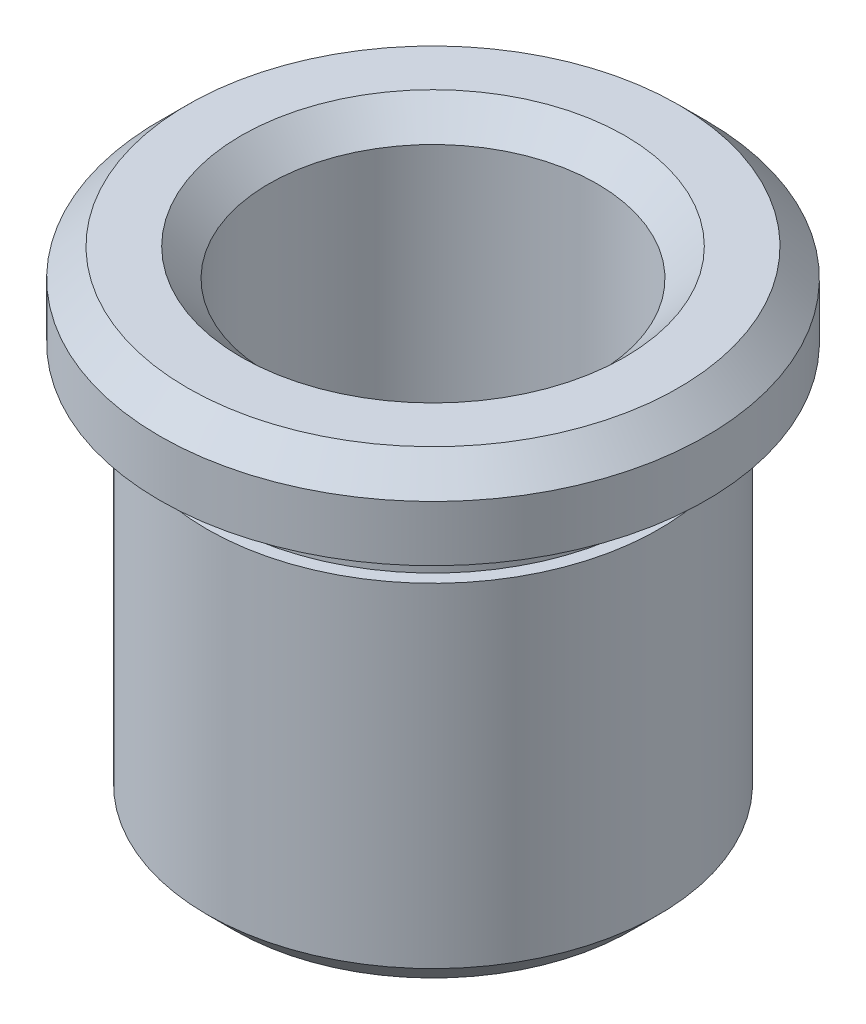
ISO-10303-21;
HEADER;
FILE_DESCRIPTION(('STEP AP214'),'2;1');
FILE_NAME('part.step','',(''),(''),'','','');
FILE_SCHEMA(('AUTOMOTIVE_DESIGN { 1 0 10303 214 1 1 1 1 }'));
ENDSEC;
DATA;
#1=APPLICATION_CONTEXT('core data for automotive mechanical design processes');
#2=APPLICATION_PROTOCOL_DEFINITION('international standard','automotive_design',2000,#1);
#3=PRODUCT_CONTEXT('',#1,'mechanical');
#4=PRODUCT('Part','Part','',(#3));
#5=PRODUCT_RELATED_PRODUCT_CATEGORY('part','',(#4));
#6=PRODUCT_DEFINITION_FORMATION('','',#4);
#7=PRODUCT_DEFINITION_CONTEXT('part definition',#1,'design');
#8=PRODUCT_DEFINITION('design','',#6,#7);
#9=PRODUCT_DEFINITION_SHAPE('','',#8);
#10=(LENGTH_UNIT() NAMED_UNIT(*) SI_UNIT(.MILLI.,.METRE.));
#11=(NAMED_UNIT(*) PLANE_ANGLE_UNIT() SI_UNIT($,.RADIAN.));
#12=(NAMED_UNIT(*) SI_UNIT($,.STERADIAN.) SOLID_ANGLE_UNIT());
#13=UNCERTAINTY_MEASURE_WITH_UNIT(LENGTH_MEASURE(1.E-05),#10,'distance_accuracy_value','');
#14=(GEOMETRIC_REPRESENTATION_CONTEXT(3) GLOBAL_UNCERTAINTY_ASSIGNED_CONTEXT((#13)) GLOBAL_UNIT_ASSIGNED_CONTEXT((#10,
#11,#12)) REPRESENTATION_CONTEXT('',''));
#15=CARTESIAN_POINT('',(0.,0.,0.));
#16=DIRECTION('',(0.,0.,1.));
#17=DIRECTION('',(1.,0.,0.));
#18=AXIS2_PLACEMENT_3D('',#15,#16,#17);
#19=CARTESIAN_POINT('',(0.,9.017,0.));
#20=DIRECTION('',(0.,1.,0.));
#21=DIRECTION('',(0.,0.,1.));
#22=AXIS2_PLACEMENT_3D('',#19,#20,#21);
#23=CONICAL_SURFACE('',#22,3.5052,0.785398163397449);
#24=CARTESIAN_POINT('',(0.,8.509,0.));
#25=DIRECTION('',(0.,-1.,0.));
#26=DIRECTION('',(0.,0.,-1.));
#27=AXIS2_PLACEMENT_3D('',#24,#25,#26);
#28=CIRCLE('',#27,2.9972);
#29=CARTESIAN_POINT('',(0.,8.509,-2.9972));
#30=VERTEX_POINT('',#29);
#31=EDGE_CURVE('E82',#30,#30,#28,.T.);
#32=ORIENTED_EDGE('',*,*,#31,.T.);
#33=EDGE_LOOP('',(#32));
#34=FACE_BOUND('',#33,.T.);
#35=CARTESIAN_POINT('',(0.,9.017,0.));
#36=DIRECTION('',(0.,-1.,0.));
#37=DIRECTION('',(0.,0.,-1.));
#38=AXIS2_PLACEMENT_3D('',#35,#36,#37);
#39=CIRCLE('',#38,3.5052);
#40=CARTESIAN_POINT('',(0.,9.017,-3.5052));
#41=VERTEX_POINT('',#40);
#42=EDGE_CURVE('E10',#41,#41,#39,.T.);
#43=ORIENTED_EDGE('',*,*,#42,.F.);
#44=EDGE_LOOP('',(#43));
#45=FACE_BOUND('',#44,.T.);
#46=ADVANCED_FACE('F39',(#34,#45),#23,.F.);
#47=CARTESIAN_POINT('',(4.4831,9.017,0.));
#48=DIRECTION('',(0.,1.,0.));
#49=DIRECTION('',(0.,0.,1.));
#50=AXIS2_PLACEMENT_3D('',#47,#48,#49);
#51=PLANE('',#50);
#52=ORIENTED_EDGE('',*,*,#42,.T.);
#53=EDGE_LOOP('',(#52));
#54=FACE_BOUND('',#53,.T.);
#55=CARTESIAN_POINT('',(0.,9.017,0.));
#56=DIRECTION('',(0.,-1.,0.));
#57=DIRECTION('',(0.,0.,-1.));
#58=AXIS2_PLACEMENT_3D('',#55,#56,#57);
#59=CIRCLE('',#58,4.4831);
#60=CARTESIAN_POINT('',(0.,9.017,-4.4831));
#61=VERTEX_POINT('',#60);
#62=EDGE_CURVE('E44',#61,#61,#59,.T.);
#63=ORIENTED_EDGE('',*,*,#62,.F.);
#64=EDGE_LOOP('',(#63));
#65=FACE_BOUND('',#64,.T.);
#66=ADVANCED_FACE('F104',(#54,#65),#51,.T.);
#67=CARTESIAN_POINT('',(0.,8.509,0.));
#68=DIRECTION('',(0.,-1.,0.));
#69=DIRECTION('',(0.,0.,-1.));
#70=AXIS2_PLACEMENT_3D('',#67,#68,#69);
#71=CONICAL_SURFACE('',#70,4.9911,0.78539816339745);
#72=ORIENTED_EDGE('',*,*,#62,.T.);
#73=EDGE_LOOP('',(#72));
#74=FACE_BOUND('',#73,.T.);
#75=CARTESIAN_POINT('',(0.,8.509,0.));
#76=DIRECTION('',(0.,-1.,0.));
#77=DIRECTION('',(0.,0.,-1.));
#78=AXIS2_PLACEMENT_3D('',#75,#76,#77);
#79=CIRCLE('',#78,4.9911);
#80=CARTESIAN_POINT('',(0.,8.509,-4.9911));
#81=VERTEX_POINT('',#80);
#82=EDGE_CURVE('E47',#81,#81,#79,.T.);
#83=ORIENTED_EDGE('',*,*,#82,.F.);
#84=EDGE_LOOP('',(#83));
#85=FACE_BOUND('',#84,.T.);
#86=ADVANCED_FACE('F107',(#74,#85),#71,.T.);
#87=CARTESIAN_POINT('',(0.,0.,0.));
#88=DIRECTION('',(0.,-1.,0.));
#89=DIRECTION('',(0.,0.,-1.));
#90=AXIS2_PLACEMENT_3D('',#87,#88,#89);
#91=CYLINDRICAL_SURFACE('',#90,4.9911);
#92=ORIENTED_EDGE('',*,*,#82,.T.);
#93=EDGE_LOOP('',(#92));
#94=FACE_BOUND('',#93,.T.);
#95=CARTESIAN_POINT('',(0.,7.493,0.));
#96=DIRECTION('',(0.,-1.,0.));
#97=DIRECTION('',(0.,0.,-1.));
#98=AXIS2_PLACEMENT_3D('',#95,#96,#97);
#99=CIRCLE('',#98,4.9911);
#100=CARTESIAN_POINT('',(0.,7.493,-4.9911));
#101=VERTEX_POINT('',#100);
#102=EDGE_CURVE('E52',#101,#101,#99,.T.);
#103=ORIENTED_EDGE('',*,*,#102,.F.);
#104=EDGE_LOOP('',(#103));
#105=FACE_BOUND('',#104,.T.);
#106=ADVANCED_FACE('F112',(#94,#105),#91,.T.);
#107=CARTESIAN_POINT('',(3.8989,7.493,0.));
#108=DIRECTION('',(0.,-1.,0.));
#109=DIRECTION('',(0.,0.,-1.));
#110=AXIS2_PLACEMENT_3D('',#107,#108,#109);
#111=PLANE('',#110);
#112=ORIENTED_EDGE('',*,*,#102,.T.);
#113=EDGE_LOOP('',(#112));
#114=FACE_BOUND('',#113,.T.);
#115=CARTESIAN_POINT('',(0.,7.493,0.));
#116=DIRECTION('',(0.,-1.,0.));
#117=DIRECTION('',(0.,0.,-1.));
#118=AXIS2_PLACEMENT_3D('',#115,#116,#117);
#119=CIRCLE('',#118,3.8989);
#120=CARTESIAN_POINT('',(0.,7.493,-3.8989));
#121=VERTEX_POINT('',#120);
#122=EDGE_CURVE('E59',#121,#121,#119,.T.);
#123=ORIENTED_EDGE('',*,*,#122,.F.);
#124=EDGE_LOOP('',(#123));
#125=FACE_BOUND('',#124,.T.);
#126=ADVANCED_FACE('F117',(#114,#125),#111,.T.);
#127=CARTESIAN_POINT('',(0.,0.,0.));
#128=DIRECTION('',(0.,-1.,0.));
#129=DIRECTION('',(0.,0.,-1.));
#130=AXIS2_PLACEMENT_3D('',#127,#128,#129);
#131=CYLINDRICAL_SURFACE('',#130,3.8989);
#132=ORIENTED_EDGE('',*,*,#122,.T.);
#133=EDGE_LOOP('',(#132));
#134=FACE_BOUND('',#133,.T.);
#135=CARTESIAN_POINT('',(0.,6.604,0.));
#136=DIRECTION('',(0.,-1.,0.));
#137=DIRECTION('',(0.,0.,-1.));
#138=AXIS2_PLACEMENT_3D('',#135,#136,#137);
#139=CIRCLE('',#138,3.8989);
#140=CARTESIAN_POINT('',(0.,6.604,-3.8989));
#141=VERTEX_POINT('',#140);
#142=EDGE_CURVE('E61',#141,#141,#139,.T.);
#143=ORIENTED_EDGE('',*,*,#142,.F.);
#144=EDGE_LOOP('',(#143));
#145=FACE_BOUND('',#144,.T.);
#146=ADVANCED_FACE('F123',(#134,#145),#131,.T.);
#147=CARTESIAN_POINT('',(4.1275,6.604,0.));
#148=DIRECTION('',(0.,1.,0.));
#149=DIRECTION('',(0.,0.,1.));
#150=AXIS2_PLACEMENT_3D('',#147,#148,#149);
#151=PLANE('',#150);
#152=ORIENTED_EDGE('',*,*,#142,.T.);
#153=EDGE_LOOP('',(#152));
#154=FACE_BOUND('',#153,.T.);
#155=CARTESIAN_POINT('',(0.,6.604,0.));
#156=DIRECTION('',(0.,-1.,0.));
#157=DIRECTION('',(0.,0.,-1.));
#158=AXIS2_PLACEMENT_3D('',#155,#156,#157);
#159=CIRCLE('',#158,4.1275);
#160=CARTESIAN_POINT('',(0.,6.604,-4.1275));
#161=VERTEX_POINT('',#160);
#162=EDGE_CURVE('E63',#161,#161,#159,.T.);
#163=ORIENTED_EDGE('',*,*,#162,.F.);
#164=EDGE_LOOP('',(#163));
#165=FACE_BOUND('',#164,.T.);
#166=ADVANCED_FACE('F124',(#154,#165),#151,.T.);
#167=CARTESIAN_POINT('',(0.,0.,0.));
#168=DIRECTION('',(0.,-1.,0.));
#169=DIRECTION('',(0.,0.,-1.));
#170=AXIS2_PLACEMENT_3D('',#167,#168,#169);
#171=CYLINDRICAL_SURFACE('',#170,4.1275);
#172=ORIENTED_EDGE('',*,*,#162,.T.);
#173=EDGE_LOOP('',(#172));
#174=FACE_BOUND('',#173,.T.);
#175=CARTESIAN_POINT('',(0.,0.508000000000002,0.));
#176=DIRECTION('',(0.,-1.,0.));
#177=DIRECTION('',(0.,0.,-1.));
#178=AXIS2_PLACEMENT_3D('',#175,#176,#177);
#179=CIRCLE('',#178,4.1275);
#180=CARTESIAN_POINT('',(0.,0.508000000000002,-4.1275));
#181=VERTEX_POINT('',#180);
#182=EDGE_CURVE('E70',#181,#181,#179,.T.);
#183=ORIENTED_EDGE('',*,*,#182,.F.);
#184=EDGE_LOOP('',(#183));
#185=FACE_BOUND('',#184,.T.);
#186=ADVANCED_FACE('F129',(#174,#185),#171,.T.);
#187=CARTESIAN_POINT('',(0.,0.,0.));
#188=DIRECTION('',(0.,1.,0.));
#189=DIRECTION('',(0.,0.,1.));
#190=AXIS2_PLACEMENT_3D('',#187,#188,#189);
#191=CONICAL_SURFACE('',#190,3.6195,0.785398163397447);
#192=ORIENTED_EDGE('',*,*,#182,.T.);
#193=EDGE_LOOP('',(#192));
#194=FACE_BOUND('',#193,.T.);
#195=CARTESIAN_POINT('',(0.,0.,0.));
#196=DIRECTION('',(0.,-1.,0.));
#197=DIRECTION('',(0.,0.,-1.));
#198=AXIS2_PLACEMENT_3D('',#195,#196,#197);
#199=CIRCLE('',#198,3.6195);
#200=CARTESIAN_POINT('',(0.,0.,-3.6195));
#201=VERTEX_POINT('',#200);
#202=EDGE_CURVE('E68',#201,#201,#199,.T.);
#203=ORIENTED_EDGE('',*,*,#202,.F.);
#204=EDGE_LOOP('',(#203));
#205=FACE_BOUND('',#204,.T.);
#206=ADVANCED_FACE('F133',(#194,#205),#191,.T.);
#207=CARTESIAN_POINT('',(1.4224,0.,0.));
#208=DIRECTION('',(0.,-1.,0.));
#209=DIRECTION('',(0.,0.,-1.));
#210=AXIS2_PLACEMENT_3D('',#207,#208,#209);
#211=PLANE('',#210);
#212=ORIENTED_EDGE('',*,*,#202,.T.);
#213=EDGE_LOOP('',(#212));
#214=FACE_BOUND('',#213,.T.);
#215=CARTESIAN_POINT('',(0.,0.,0.));
#216=DIRECTION('',(0.,-1.,0.));
#217=DIRECTION('',(0.,0.,-1.));
#218=AXIS2_PLACEMENT_3D('',#215,#216,#217);
#219=CIRCLE('',#218,1.4224);
#220=CARTESIAN_POINT('',(0.,0.,-1.4224));
#221=VERTEX_POINT('',#220);
#222=EDGE_CURVE('E74',#221,#221,#219,.T.);
#223=ORIENTED_EDGE('',*,*,#222,.F.);
#224=EDGE_LOOP('',(#223));
#225=FACE_BOUND('',#224,.T.);
#226=ADVANCED_FACE('F140',(#214,#225),#211,.T.);
#227=CARTESIAN_POINT('',(0.,0.,0.));
#228=DIRECTION('',(0.,-1.,0.));
#229=DIRECTION('',(0.,0.,-1.));
#230=AXIS2_PLACEMENT_3D('',#227,#228,#229);
#231=CYLINDRICAL_SURFACE('',#230,1.4224);
#232=ORIENTED_EDGE('',*,*,#222,.T.);
#233=EDGE_LOOP('',(#232));
#234=FACE_BOUND('',#233,.T.);
#235=CARTESIAN_POINT('',(0.,1.33477823553537,0.));
#236=DIRECTION('',(0.,-1.,0.));
#237=DIRECTION('',(0.,0.,-1.));
#238=AXIS2_PLACEMENT_3D('',#235,#236,#237);
#239=CIRCLE('',#238,1.4224);
#240=CARTESIAN_POINT('',(0.,1.33477823553537,-1.4224));
#241=VERTEX_POINT('',#240);
#242=EDGE_CURVE('E78',#241,#241,#239,.T.);
#243=ORIENTED_EDGE('',*,*,#242,.F.);
#244=EDGE_LOOP('',(#243));
#245=FACE_BOUND('',#244,.T.);
#246=ADVANCED_FACE('F141',(#234,#245),#231,.F.);
#247=CARTESIAN_POINT('',(2.19746742616076,1.33477823553537,0.));
#248=DIRECTION('',(0.,1.,0.));
#249=DIRECTION('',(0.,0.,1.));
#250=AXIS2_PLACEMENT_3D('',#247,#248,#249);
#251=PLANE('',#250);
#252=ORIENTED_EDGE('',*,*,#242,.T.);
#253=EDGE_LOOP('',(#252));
#254=FACE_BOUND('',#253,.T.);
#255=CARTESIAN_POINT('',(0.,1.33477823553537,0.));
#256=DIRECTION('',(0.,-1.,0.));
#257=DIRECTION('',(0.,0.,-1.));
#258=AXIS2_PLACEMENT_3D('',#255,#256,#257);
#259=CIRCLE('',#258,2.19746742616076);
#260=CARTESIAN_POINT('',(0.,1.33477823553537,-2.19746742616076));
#261=VERTEX_POINT('',#260);
#262=EDGE_CURVE('E80',#261,#261,#259,.T.);
#263=ORIENTED_EDGE('',*,*,#262,.F.);
#264=EDGE_LOOP('',(#263));
#265=FACE_BOUND('',#264,.T.);
#266=ADVANCED_FACE('F98',(#254,#265),#251,.T.);
#267=CARTESIAN_POINT('',(0.,2.1345108093746,0.));
#268=DIRECTION('',(0.,1.,0.));
#269=DIRECTION('',(0.,0.,1.));
#270=AXIS2_PLACEMENT_3D('',#267,#268,#269);
#271=CONICAL_SURFACE('',#270,2.9972,0.785398163397453);
#272=ORIENTED_EDGE('',*,*,#262,.T.);
#273=EDGE_LOOP('',(#272));
#274=FACE_BOUND('',#273,.T.);
#275=CARTESIAN_POINT('',(0.,2.1345108093746,0.));
#276=DIRECTION('',(0.,-1.,0.));
#277=DIRECTION('',(0.,0.,-1.));
#278=AXIS2_PLACEMENT_3D('',#275,#276,#277);
#279=CIRCLE('',#278,2.9972);
#280=CARTESIAN_POINT('',(0.,2.1345108093746,-2.9972));
#281=VERTEX_POINT('',#280);
#282=EDGE_CURVE('E85',#281,#281,#279,.T.);
#283=ORIENTED_EDGE('',*,*,#282,.F.);
#284=EDGE_LOOP('',(#283));
#285=FACE_BOUND('',#284,.T.);
#286=ADVANCED_FACE('F93',(#274,#285),#271,.F.);
#287=CARTESIAN_POINT('',(0.,0.,0.));
#288=DIRECTION('',(0.,-1.,0.));
#289=DIRECTION('',(0.,0.,-1.));
#290=AXIS2_PLACEMENT_3D('',#287,#288,#289);
#291=CYLINDRICAL_SURFACE('',#290,2.9972);
#292=ORIENTED_EDGE('',*,*,#282,.T.);
#293=EDGE_LOOP('',(#292));
#294=FACE_BOUND('',#293,.T.);
#295=ORIENTED_EDGE('',*,*,#31,.F.);
#296=EDGE_LOOP('',(#295));
#297=FACE_BOUND('',#296,.T.);
#298=ADVANCED_FACE('F91',(#294,#297),#291,.F.);
#299=CLOSED_SHELL('',(#46,#66,#86,#106,#126,#146,#166,#186,#206,#226,#246,#266,#286,#298));
#300=MANIFOLD_SOLID_BREP('B2',#299);
#301=ADVANCED_BREP_SHAPE_REPRESENTATION('',(#18,#300),#14);
#302=SHAPE_DEFINITION_REPRESENTATION(#9,#301);
ENDSEC;
END-ISO-10303-21;
